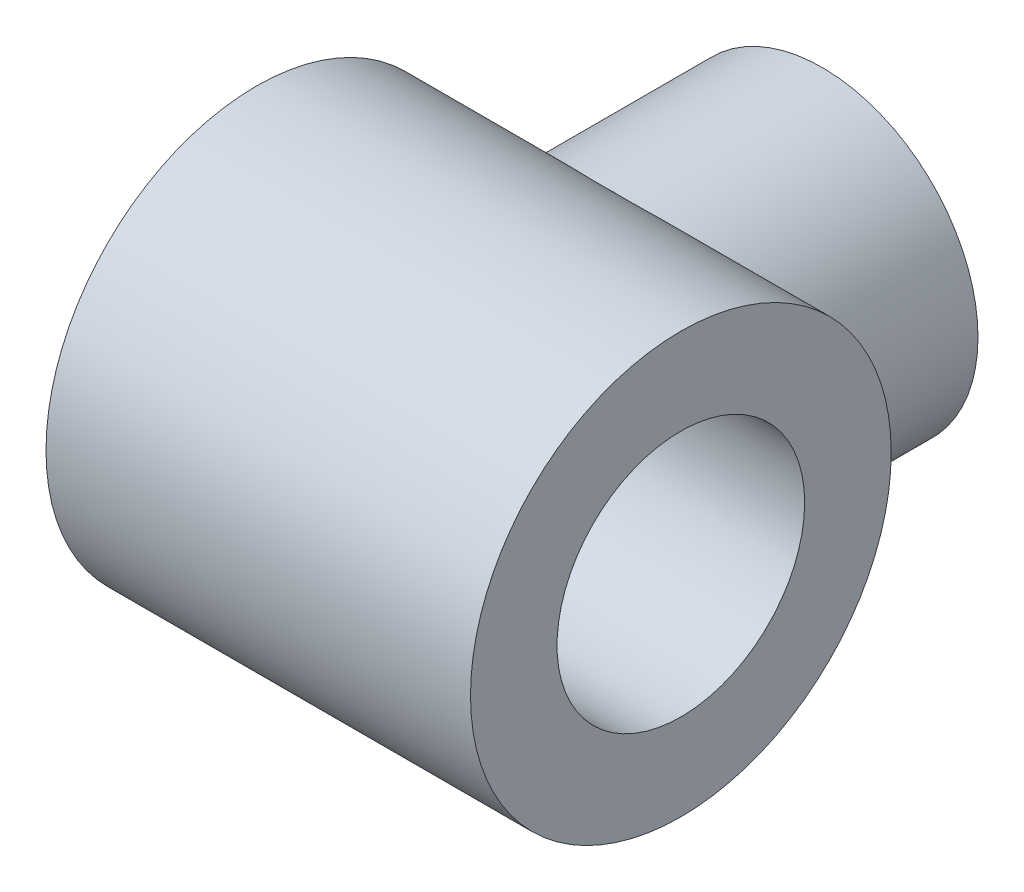
ISO-10303-21;
HEADER;
FILE_DESCRIPTION(('STEP AP214'),'2;1');
FILE_NAME('part.step','',(''),(''),'','','');
FILE_SCHEMA(('AUTOMOTIVE_DESIGN { 1 0 10303 214 1 1 1 1 }'));
ENDSEC;
DATA;
#1=APPLICATION_CONTEXT('core data for automotive mechanical design processes');
#2=APPLICATION_PROTOCOL_DEFINITION('international standard','automotive_design',2000,#1);
#3=PRODUCT_CONTEXT('',#1,'mechanical');
#4=PRODUCT('Part','Part','',(#3));
#5=PRODUCT_RELATED_PRODUCT_CATEGORY('part','',(#4));
#6=PRODUCT_DEFINITION_FORMATION('','',#4);
#7=PRODUCT_DEFINITION_CONTEXT('part definition',#1,'design');
#8=PRODUCT_DEFINITION('design','',#6,#7);
#9=PRODUCT_DEFINITION_SHAPE('','',#8);
#10=(LENGTH_UNIT() NAMED_UNIT(*) SI_UNIT(.MILLI.,.METRE.));
#11=(NAMED_UNIT(*) PLANE_ANGLE_UNIT() SI_UNIT($,.RADIAN.));
#12=(NAMED_UNIT(*) SI_UNIT($,.STERADIAN.) SOLID_ANGLE_UNIT());
#13=UNCERTAINTY_MEASURE_WITH_UNIT(LENGTH_MEASURE(1.E-05),#10,'distance_accuracy_value','');
#14=(GEOMETRIC_REPRESENTATION_CONTEXT(3) GLOBAL_UNCERTAINTY_ASSIGNED_CONTEXT((#13)) GLOBAL_UNIT_ASSIGNED_CONTEXT((#10,
#11,#12)) REPRESENTATION_CONTEXT('',''));
#15=CARTESIAN_POINT('',(0.,0.,0.));
#16=DIRECTION('',(0.,0.,1.));
#17=DIRECTION('',(1.,0.,0.));
#18=AXIS2_PLACEMENT_3D('',#15,#16,#17);
#19=CARTESIAN_POINT('',(-3.,0.,5.));
#20=DIRECTION('',(1.,0.,0.));
#21=DIRECTION('',(0.,0.,-1.));
#22=AXIS2_PLACEMENT_3D('',#19,#20,#21);
#23=CYLINDRICAL_SURFACE('',#22,2.9732137494637);
#24=CARTESIAN_POINT('',(-3.,0.,5.));
#25=DIRECTION('',(1.,0.,0.));
#26=DIRECTION('',(0.,0.,-1.));
#27=AXIS2_PLACEMENT_3D('',#24,#25,#26);
#28=CIRCLE('',#27,2.9732137494637);
#29=CARTESIAN_POINT('',(-3.,0.,2.0267862505363));
#30=VERTEX_POINT('',#29);
#31=EDGE_CURVE('E11',#30,#30,#28,.T.);
#32=ORIENTED_EDGE('',*,*,#31,.T.);
#33=EDGE_LOOP('',(#32));
#34=FACE_BOUND('',#33,.T.);
#35=CARTESIAN_POINT('',(3.,0.,5.));
#36=DIRECTION('',(1.,0.,0.));
#37=DIRECTION('',(0.,0.,-1.));
#38=AXIS2_PLACEMENT_3D('',#35,#36,#37);
#39=CIRCLE('',#38,2.9732137494637);
#40=CARTESIAN_POINT('',(3.,0.,2.0267862505363));
#41=VERTEX_POINT('',#40);
#42=EDGE_CURVE('E57',#41,#41,#39,.T.);
#43=ORIENTED_EDGE('',*,*,#42,.F.);
#44=EDGE_LOOP('',(#43));
#45=FACE_BOUND('',#44,.T.);
#46=ADVANCED_FACE('F45',(#34,#45),#23,.T.);
#47=CARTESIAN_POINT('',(-3.,0.,5.));
#48=DIRECTION('',(1.,0.,0.));
#49=DIRECTION('',(0.,0.,-1.));
#50=AXIS2_PLACEMENT_3D('',#47,#48,#49);
#51=PLANE('',#50);
#52=CARTESIAN_POINT('',(-3.,0.,5.));
#53=DIRECTION('',(1.,0.,0.));
#54=DIRECTION('',(0.,0.,-1.));
#55=AXIS2_PLACEMENT_3D('',#52,#53,#54);
#56=CIRCLE('',#55,1.75);
#57=CARTESIAN_POINT('',(-3.,0.,3.25));
#58=VERTEX_POINT('',#57);
#59=EDGE_CURVE('E52',#58,#58,#56,.T.);
#60=ORIENTED_EDGE('',*,*,#59,.T.);
#61=EDGE_LOOP('',(#60));
#62=FACE_BOUND('',#61,.T.);
#63=ORIENTED_EDGE('',*,*,#31,.F.);
#64=EDGE_LOOP('',(#63));
#65=FACE_BOUND('',#64,.T.);
#66=ADVANCED_FACE('F78',(#62,#65),#51,.F.);
#67=CARTESIAN_POINT('',(-3.,0.,5.));
#68=DIRECTION('',(1.,0.,0.));
#69=DIRECTION('',(0.,0.,-1.));
#70=AXIS2_PLACEMENT_3D('',#67,#68,#69);
#71=CYLINDRICAL_SURFACE('',#70,1.75);
#72=ORIENTED_EDGE('',*,*,#59,.F.);
#73=EDGE_LOOP('',(#72));
#74=FACE_BOUND('',#73,.T.);
#75=CARTESIAN_POINT('',(3.,0.,5.));
#76=DIRECTION('',(1.,0.,0.));
#77=DIRECTION('',(0.,0.,-1.));
#78=AXIS2_PLACEMENT_3D('',#75,#76,#77);
#79=CIRCLE('',#78,1.75);
#80=CARTESIAN_POINT('',(3.,0.,3.25));
#81=VERTEX_POINT('',#80);
#82=EDGE_CURVE('E62',#81,#81,#79,.T.);
#83=ORIENTED_EDGE('',*,*,#82,.T.);
#84=EDGE_LOOP('',(#83));
#85=FACE_BOUND('',#84,.T.);
#86=ADVANCED_FACE('F69',(#74,#85),#71,.F.);
#87=CARTESIAN_POINT('',(3.,0.,5.));
#88=DIRECTION('',(1.,0.,0.));
#89=DIRECTION('',(0.,0.,-1.));
#90=AXIS2_PLACEMENT_3D('',#87,#88,#89);
#91=PLANE('',#90);
#92=ORIENTED_EDGE('',*,*,#42,.T.);
#93=EDGE_LOOP('',(#92));
#94=FACE_BOUND('',#93,.T.);
#95=ORIENTED_EDGE('',*,*,#82,.F.);
#96=EDGE_LOOP('',(#95));
#97=FACE_BOUND('',#96,.T.);
#98=ADVANCED_FACE('F71',(#94,#97),#91,.T.);
#99=CLOSED_SHELL('',(#46,#66,#86,#98));
#100=MANIFOLD_SOLID_BREP('B2',#99);
#101=CARTESIAN_POINT('',(0.,0.,3.));
#102=DIRECTION('',(0.,0.,1.));
#103=DIRECTION('',(1.,0.,0.));
#104=AXIS2_PLACEMENT_3D('',#101,#102,#103);
#105=PLANE('',#104);
#106=CARTESIAN_POINT('',(0.,0.,3.));
#107=DIRECTION('',(0.,0.,1.));
#108=DIRECTION('',(1.,0.,0.));
#109=AXIS2_PLACEMENT_3D('',#106,#107,#108);
#110=CIRCLE('',#109,2.2);
#111=CARTESIAN_POINT('',(2.2,0.,3.));
#112=VERTEX_POINT('',#111);
#113=EDGE_CURVE('E44',#112,#112,#110,.T.);
#114=ORIENTED_EDGE('',*,*,#113,.T.);
#115=EDGE_LOOP('',(#114));
#116=FACE_BOUND('',#115,.T.);
#117=CARTESIAN_POINT('',(0.,0.,3.));
#118=DIRECTION('',(0.,0.,1.));
#119=DIRECTION('',(1.,0.,0.));
#120=AXIS2_PLACEMENT_3D('',#117,#118,#119);
#121=CIRCLE('',#120,1.2);
#122=CARTESIAN_POINT('',(1.2,0.,3.));
#123=VERTEX_POINT('',#122);
#124=EDGE_CURVE('E122',#123,#123,#121,.T.);
#125=ORIENTED_EDGE('',*,*,#124,.F.);
#126=EDGE_LOOP('',(#125));
#127=FACE_BOUND('',#126,.T.);
#128=ADVANCED_FACE('F111',(#116,#127),#105,.T.);
#129=CARTESIAN_POINT('',(0.,0.,0.));
#130=DIRECTION('',(0.,0.,1.));
#131=DIRECTION('',(1.,0.,0.));
#132=AXIS2_PLACEMENT_3D('',#129,#130,#131);
#133=PLANE('',#132);
#134=CARTESIAN_POINT('',(0.,0.,0.));
#135=DIRECTION('',(0.,0.,1.));
#136=DIRECTION('',(1.,0.,0.));
#137=AXIS2_PLACEMENT_3D('',#134,#135,#136);
#138=CIRCLE('',#137,2.2);
#139=CARTESIAN_POINT('',(2.2,0.,0.));
#140=VERTEX_POINT('',#139);
#141=EDGE_CURVE('E115',#140,#140,#138,.T.);
#142=ORIENTED_EDGE('',*,*,#141,.F.);
#143=EDGE_LOOP('',(#142));
#144=FACE_BOUND('',#143,.T.);
#145=CARTESIAN_POINT('',(0.,0.,0.));
#146=DIRECTION('',(0.,0.,1.));
#147=DIRECTION('',(1.,0.,0.));
#148=AXIS2_PLACEMENT_3D('',#145,#146,#147);
#149=CIRCLE('',#148,1.2);
#150=CARTESIAN_POINT('',(1.2,0.,0.));
#151=VERTEX_POINT('',#150);
#152=EDGE_CURVE('E124',#151,#151,#149,.T.);
#153=ORIENTED_EDGE('',*,*,#152,.T.);
#154=EDGE_LOOP('',(#153));
#155=FACE_BOUND('',#154,.T.);
#156=ADVANCED_FACE('F134',(#144,#155),#133,.F.);
#157=CARTESIAN_POINT('',(0.,0.,3.));
#158=DIRECTION('',(0.,0.,-1.));
#159=DIRECTION('',(-1.,0.,0.));
#160=AXIS2_PLACEMENT_3D('',#157,#158,#159);
#161=CYLINDRICAL_SURFACE('',#160,2.2);
#162=ORIENTED_EDGE('',*,*,#113,.F.);
#163=EDGE_LOOP('',(#162));
#164=FACE_BOUND('',#163,.T.);
#165=ORIENTED_EDGE('',*,*,#141,.T.);
#166=EDGE_LOOP('',(#165));
#167=FACE_BOUND('',#166,.T.);
#168=ADVANCED_FACE('F113',(#164,#167),#161,.T.);
#169=CARTESIAN_POINT('',(0.,0.,3.));
#170=DIRECTION('',(0.,0.,-1.));
#171=DIRECTION('',(-1.,0.,0.));
#172=AXIS2_PLACEMENT_3D('',#169,#170,#171);
#173=CYLINDRICAL_SURFACE('',#172,1.2);
#174=ORIENTED_EDGE('',*,*,#124,.T.);
#175=EDGE_LOOP('',(#174));
#176=FACE_BOUND('',#175,.T.);
#177=ORIENTED_EDGE('',*,*,#152,.F.);
#178=EDGE_LOOP('',(#177));
#179=FACE_BOUND('',#178,.T.);
#180=ADVANCED_FACE('F130',(#176,#179),#173,.F.);
#181=CLOSED_SHELL('',(#128,#156,#168,#180));
#182=MANIFOLD_SOLID_BREP('B6',#181);
#183=ADVANCED_BREP_SHAPE_REPRESENTATION('',(#18,#100,#182),#14);
#184=SHAPE_DEFINITION_REPRESENTATION(#9,#183);
ENDSEC;
END-ISO-10303-21;
